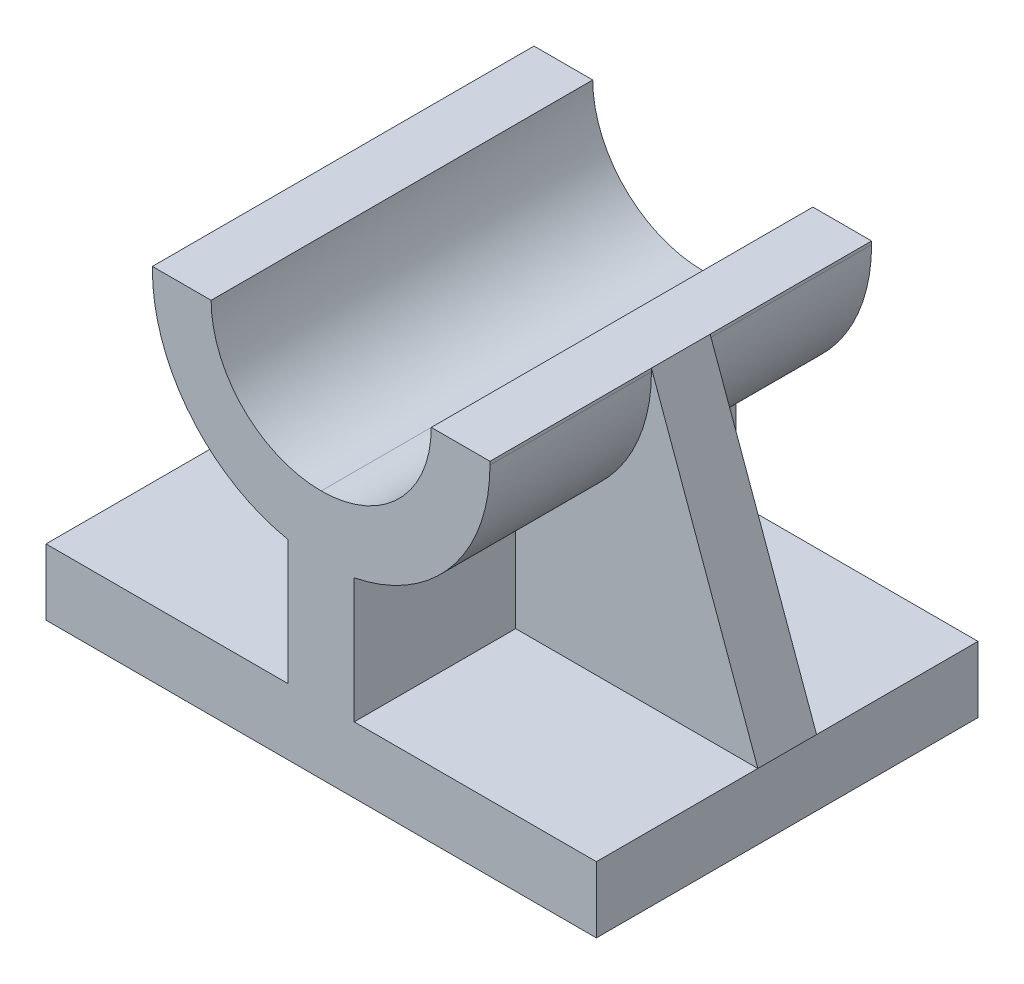
ISO-10303-21;
HEADER;
FILE_DESCRIPTION(('STEP AP214'),'2;1');
FILE_NAME('part.step','',(''),(''),'','','');
FILE_SCHEMA(('AUTOMOTIVE_DESIGN { 1 0 10303 214 1 1 1 1 }'));
ENDSEC;
DATA;
#1=APPLICATION_CONTEXT('core data for automotive mechanical design processes');
#2=APPLICATION_PROTOCOL_DEFINITION('international standard','automotive_design',2000,#1);
#3=PRODUCT_CONTEXT('',#1,'mechanical');
#4=PRODUCT('Part','Part','',(#3));
#5=PRODUCT_RELATED_PRODUCT_CATEGORY('part','',(#4));
#6=PRODUCT_DEFINITION_FORMATION('','',#4);
#7=PRODUCT_DEFINITION_CONTEXT('part definition',#1,'design');
#8=PRODUCT_DEFINITION('design','',#6,#7);
#9=PRODUCT_DEFINITION_SHAPE('','',#8);
#10=(LENGTH_UNIT() NAMED_UNIT(*) SI_UNIT(.MILLI.,.METRE.));
#11=(NAMED_UNIT(*) PLANE_ANGLE_UNIT() SI_UNIT($,.RADIAN.));
#12=(NAMED_UNIT(*) SI_UNIT($,.STERADIAN.) SOLID_ANGLE_UNIT());
#13=UNCERTAINTY_MEASURE_WITH_UNIT(LENGTH_MEASURE(1.E-05),#10,'distance_accuracy_value','');
#14=(GEOMETRIC_REPRESENTATION_CONTEXT(3) GLOBAL_UNCERTAINTY_ASSIGNED_CONTEXT((#13)) GLOBAL_UNIT_ASSIGNED_CONTEXT((#10,
#11,#12)) REPRESENTATION_CONTEXT('',''));
#15=CARTESIAN_POINT('',(0.,0.,0.));
#16=DIRECTION('',(0.,0.,1.));
#17=DIRECTION('',(1.,0.,0.));
#18=AXIS2_PLACEMENT_3D('',#15,#16,#17);
#19=CARTESIAN_POINT('',(0.,124.46,0.));
#20=DIRECTION('',(0.,-1.,0.));
#21=DIRECTION('',(0.,0.,-1.));
#22=AXIS2_PLACEMENT_3D('',#19,#20,#21);
#23=PLANE('',#22);
#24=DIRECTION('',(0.,0.,-1.));
#25=VECTOR('',#24,1.);
#26=CARTESIAN_POINT('',(153.67,124.46,132.08));
#27=LINE('',#26,#25);
#28=CARTESIAN_POINT('',(153.67,124.46,132.08));
#29=VERTEX_POINT('',#28);
#30=CARTESIAN_POINT('',(153.67,124.46,76.2));
#31=VERTEX_POINT('',#30);
#32=EDGE_CURVE('E249',#29,#31,#27,.T.);
#33=ORIENTED_EDGE('',*,*,#32,.T.);
#34=DIRECTION('',(0.,0.,-1.));
#35=VECTOR('',#34,1.);
#36=CARTESIAN_POINT('',(153.67,124.46,0.));
#37=LINE('',#36,#35);
#38=CARTESIAN_POINT('',(153.67,124.46,55.88));
#39=VERTEX_POINT('',#38);
#40=EDGE_CURVE('E310',#31,#39,#37,.T.);
#41=ORIENTED_EDGE('',*,*,#40,.T.);
#42=CARTESIAN_POINT('',(153.67,124.46,0.));
#43=VERTEX_POINT('',#42);
#44=EDGE_CURVE('E193',#39,#43,#27,.T.);
#45=ORIENTED_EDGE('',*,*,#44,.T.);
#46=DIRECTION('',(-1.,0.,0.));
#47=VECTOR('',#46,1.);
#48=CARTESIAN_POINT('',(36.83,124.46,0.));
#49=LINE('',#48,#47);
#50=CARTESIAN_POINT('',(133.35,124.46,0.));
#51=VERTEX_POINT('',#50);
#52=EDGE_CURVE('E185',#43,#51,#49,.T.);
#53=ORIENTED_EDGE('',*,*,#52,.T.);
#54=DIRECTION('',(0.,0.,-1.));
#55=VECTOR('',#54,1.);
#56=CARTESIAN_POINT('',(133.35,124.46,132.08));
#57=LINE('',#56,#55);
#58=CARTESIAN_POINT('',(133.35,124.46,132.08));
#59=VERTEX_POINT('',#58);
#60=EDGE_CURVE('E195',#59,#51,#57,.T.);
#61=ORIENTED_EDGE('',*,*,#60,.F.);
#62=DIRECTION('',(1.,0.,0.));
#63=VECTOR('',#62,1.);
#64=CARTESIAN_POINT('',(36.83,124.46,132.08));
#65=LINE('',#64,#63);
#66=EDGE_CURVE('E254',#59,#29,#65,.T.);
#67=ORIENTED_EDGE('',*,*,#66,.T.);
#68=EDGE_LOOP('',(#33,#41,#45,#53,#61,#67));
#69=FACE_BOUND('',#68,.T.);
#70=ADVANCED_FACE('F41',(#69),#23,.F.);
#71=DIRECTION('',(0.,0.,1.));
#72=VECTOR('',#71,1.);
#73=CARTESIAN_POINT('',(57.1500000000001,124.46,132.08));
#74=LINE('',#73,#72);
#75=CARTESIAN_POINT('',(57.15,124.46,0.));
#76=VERTEX_POINT('',#75);
#77=CARTESIAN_POINT('',(57.1500000000001,124.46,132.08));
#78=VERTEX_POINT('',#77);
#79=EDGE_CURVE('E197',#76,#78,#74,.T.);
#80=ORIENTED_EDGE('',*,*,#79,.F.);
#81=CARTESIAN_POINT('',(36.83,124.46,0.));
#82=VERTEX_POINT('',#81);
#83=EDGE_CURVE('E196',#76,#82,#49,.T.);
#84=ORIENTED_EDGE('',*,*,#83,.T.);
#85=DIRECTION('',(0.,0.,1.));
#86=VECTOR('',#85,1.);
#87=CARTESIAN_POINT('',(36.83,124.46,132.08));
#88=LINE('',#87,#86);
#89=CARTESIAN_POINT('',(36.83,124.46,132.08));
#90=VERTEX_POINT('',#89);
#91=EDGE_CURVE('E199',#82,#90,#88,.T.);
#92=ORIENTED_EDGE('',*,*,#91,.T.);
#93=EDGE_CURVE('E251',#90,#78,#65,.T.);
#94=ORIENTED_EDGE('',*,*,#93,.T.);
#95=EDGE_LOOP('',(#80,#84,#92,#94));
#96=FACE_BOUND('',#95,.T.);
#97=ADVANCED_FACE('F334',(#96),#23,.F.);
#98=CARTESIAN_POINT('',(36.83,124.46,132.08));
#99=DIRECTION('',(1.,0.,0.));
#100=DIRECTION('',(0.,0.,-1.));
#101=AXIS2_PLACEMENT_3D('',#98,#99,#100);
#102=PLANE('',#101);
#103=DIRECTION('',(0.,-1.,0.));
#104=VECTOR('',#103,1.);
#105=CARTESIAN_POINT('',(36.83,124.46,0.));
#106=LINE('',#105,#104);
#107=CARTESIAN_POINT('',(36.83,123.330937328691,0.));
#108=VERTEX_POINT('',#107);
#109=EDGE_CURVE('E265',#82,#108,#106,.T.);
#110=ORIENTED_EDGE('',*,*,#109,.T.);
#111=DIRECTION('',(0.,0.,-1.));
#112=VECTOR('',#111,1.);
#113=CARTESIAN_POINT('',(36.83,123.330937328691,132.08));
#114=LINE('',#113,#112);
#115=CARTESIAN_POINT('',(36.83,123.330937328691,132.08));
#116=VERTEX_POINT('',#115);
#117=EDGE_CURVE('E314',#108,#116,#114,.F.);
#118=ORIENTED_EDGE('',*,*,#117,.T.);
#119=DIRECTION('',(0.,-1.,0.));
#120=VECTOR('',#119,1.);
#121=CARTESIAN_POINT('',(36.83,124.46,132.08));
#122=LINE('',#121,#120);
#123=EDGE_CURVE('E258',#90,#116,#122,.T.);
#124=ORIENTED_EDGE('',*,*,#123,.F.);
#125=ORIENTED_EDGE('',*,*,#91,.F.);
#126=EDGE_LOOP('',(#110,#118,#124,#125));
#127=FACE_BOUND('',#126,.T.);
#128=ADVANCED_FACE('F351',(#127),#102,.F.);
#129=CARTESIAN_POINT('',(153.67,124.46,132.08));
#130=DIRECTION('',(-1.,0.,0.));
#131=DIRECTION('',(0.,0.,1.));
#132=AXIS2_PLACEMENT_3D('',#129,#130,#131);
#133=PLANE('',#132);
#134=DIRECTION('',(0.,-1.,0.));
#135=VECTOR('',#134,1.);
#136=CARTESIAN_POINT('',(153.67,124.46,132.08));
#137=LINE('',#136,#135);
#138=CARTESIAN_POINT('',(153.67,123.330937328691,132.08));
#139=VERTEX_POINT('',#138);
#140=EDGE_CURVE('E260',#29,#139,#137,.T.);
#141=ORIENTED_EDGE('',*,*,#140,.T.);
#142=DIRECTION('',(0.,0.,-1.));
#143=VECTOR('',#142,1.);
#144=CARTESIAN_POINT('',(153.67,123.330937328691,132.08));
#145=LINE('',#144,#143);
#146=CARTESIAN_POINT('',(153.67,123.330937328691,76.2));
#147=VERTEX_POINT('',#146);
#148=EDGE_CURVE('E324',#139,#147,#145,.T.);
#149=ORIENTED_EDGE('',*,*,#148,.T.);
#150=DIRECTION('',(0.,-1.,0.));
#151=VECTOR('',#150,1.);
#152=CARTESIAN_POINT('',(153.67,22.86,76.2));
#153=LINE('',#152,#151);
#154=EDGE_CURVE('E243',#31,#147,#153,.T.);
#155=ORIENTED_EDGE('',*,*,#154,.F.);
#156=ORIENTED_EDGE('',*,*,#32,.F.);
#157=EDGE_LOOP('',(#141,#149,#155,#156));
#158=FACE_BOUND('',#157,.T.);
#159=ADVANCED_FACE('F356',(#158),#133,.F.);
#160=DIRECTION('',(0.,1.,0.));
#161=VECTOR('',#160,1.);
#162=CARTESIAN_POINT('',(153.67,22.86,55.88));
#163=LINE('',#162,#161);
#164=CARTESIAN_POINT('',(153.67,123.330937328691,55.88));
#165=VERTEX_POINT('',#164);
#166=EDGE_CURVE('E241',#165,#39,#163,.T.);
#167=ORIENTED_EDGE('',*,*,#166,.F.);
#168=DIRECTION('',(0.,0.,1.));
#169=VECTOR('',#168,1.);
#170=CARTESIAN_POINT('',(153.67,123.330937328691,132.08));
#171=LINE('',#170,#169);
#172=CARTESIAN_POINT('',(153.67,123.330937328691,0.));
#173=VERTEX_POINT('',#172);
#174=EDGE_CURVE('E322',#165,#173,#171,.F.);
#175=ORIENTED_EDGE('',*,*,#174,.T.);
#176=DIRECTION('',(0.,-1.,0.));
#177=VECTOR('',#176,1.);
#178=CARTESIAN_POINT('',(153.67,124.46,0.));
#179=LINE('',#178,#177);
#180=EDGE_CURVE('E266',#43,#173,#179,.T.);
#181=ORIENTED_EDGE('',*,*,#180,.F.);
#182=ORIENTED_EDGE('',*,*,#44,.F.);
#183=EDGE_LOOP('',(#167,#175,#181,#182));
#184=FACE_BOUND('',#183,.T.);
#185=ADVANCED_FACE('F359',(#184),#133,.F.);
#186=CARTESIAN_POINT('',(0.,22.86,0.));
#187=DIRECTION('',(0.,1.,0.));
#188=DIRECTION('',(0.,0.,1.));
#189=AXIS2_PLACEMENT_3D('',#186,#187,#188);
#190=PLANE('',#189);
#191=DIRECTION('',(0.,0.,-1.));
#192=VECTOR('',#191,1.);
#193=CARTESIAN_POINT('',(190.5,22.86,0.));
#194=LINE('',#193,#192);
#195=CARTESIAN_POINT('',(190.5,22.86,132.08));
#196=VERTEX_POINT('',#195);
#197=CARTESIAN_POINT('',(190.5,22.86,76.2));
#198=VERTEX_POINT('',#197);
#199=EDGE_CURVE('E280',#196,#198,#194,.T.);
#200=ORIENTED_EDGE('',*,*,#199,.T.);
#201=DIRECTION('',(-1.,0.,0.));
#202=VECTOR('',#201,1.);
#203=CARTESIAN_POINT('',(190.5,22.86,76.2));
#204=LINE('',#203,#202);
#205=CARTESIAN_POINT('',(106.68,22.86,76.2));
#206=VERTEX_POINT('',#205);
#207=EDGE_CURVE('E247',#198,#206,#204,.T.);
#208=ORIENTED_EDGE('',*,*,#207,.T.);
#209=DIRECTION('',(0.,0.,-1.));
#210=VECTOR('',#209,1.);
#211=CARTESIAN_POINT('',(106.68,22.86,76.2));
#212=LINE('',#211,#210);
#213=CARTESIAN_POINT('',(106.68,22.86,132.08));
#214=VERTEX_POINT('',#213);
#215=EDGE_CURVE('E228',#214,#206,#212,.T.);
#216=ORIENTED_EDGE('',*,*,#215,.F.);
#217=DIRECTION('',(1.,0.,0.));
#218=VECTOR('',#217,1.);
#219=CARTESIAN_POINT('',(0.,22.86,132.08));
#220=LINE('',#219,#218);
#221=EDGE_CURVE('E275',#214,#196,#220,.T.);
#222=ORIENTED_EDGE('',*,*,#221,.T.);
#223=EDGE_LOOP('',(#200,#208,#216,#222));
#224=FACE_BOUND('',#223,.T.);
#225=ADVANCED_FACE('F361',(#224),#190,.T.);
#226=DIRECTION('',(-1.,0.,0.));
#227=VECTOR('',#226,1.);
#228=CARTESIAN_POINT('',(190.5,22.86,55.88));
#229=LINE('',#228,#227);
#230=CARTESIAN_POINT('',(190.5,22.86,55.88));
#231=VERTEX_POINT('',#230);
#232=CARTESIAN_POINT('',(106.68,22.86,55.88));
#233=VERTEX_POINT('',#232);
#234=EDGE_CURVE('E246',#231,#233,#229,.T.);
#235=ORIENTED_EDGE('',*,*,#234,.F.);
#236=CARTESIAN_POINT('',(190.5,22.86,0.));
#237=VERTEX_POINT('',#236);
#238=EDGE_CURVE('E277',#231,#237,#194,.T.);
#239=ORIENTED_EDGE('',*,*,#238,.T.);
#240=DIRECTION('',(-1.,0.,0.));
#241=VECTOR('',#240,1.);
#242=CARTESIAN_POINT('',(0.,22.86,0.));
#243=LINE('',#242,#241);
#244=CARTESIAN_POINT('',(106.68,22.86,0.));
#245=VERTEX_POINT('',#244);
#246=EDGE_CURVE('E284',#237,#245,#243,.T.);
#247=ORIENTED_EDGE('',*,*,#246,.T.);
#248=DIRECTION('',(0.,0.,-1.));
#249=VECTOR('',#248,1.);
#250=CARTESIAN_POINT('',(106.68,22.86,55.88));
#251=LINE('',#250,#249);
#252=EDGE_CURVE('E235',#233,#245,#251,.T.);
#253=ORIENTED_EDGE('',*,*,#252,.F.);
#254=EDGE_LOOP('',(#235,#239,#247,#253));
#255=FACE_BOUND('',#254,.T.);
#256=ADVANCED_FACE('F369',(#255),#190,.T.);
#257=CARTESIAN_POINT('',(0.,22.86,0.));
#258=DIRECTION('',(1.,0.,0.));
#259=DIRECTION('',(0.,0.,-1.));
#260=AXIS2_PLACEMENT_3D('',#257,#258,#259);
#261=PLANE('',#260);
#262=DIRECTION('',(0.,0.,1.));
#263=VECTOR('',#262,1.);
#264=CARTESIAN_POINT('',(0.,0.,0.));
#265=LINE('',#264,#263);
#266=CARTESIAN_POINT('',(0.,0.,0.));
#267=VERTEX_POINT('',#266);
#268=CARTESIAN_POINT('',(0.,0.,132.08));
#269=VERTEX_POINT('',#268);
#270=EDGE_CURVE('E269',#267,#269,#265,.T.);
#271=ORIENTED_EDGE('',*,*,#270,.T.);
#272=DIRECTION('',(0.,-1.,0.));
#273=VECTOR('',#272,1.);
#274=CARTESIAN_POINT('',(0.,22.86,132.08));
#275=LINE('',#274,#273);
#276=CARTESIAN_POINT('',(0.,22.86,132.08));
#277=VERTEX_POINT('',#276);
#278=EDGE_CURVE('E299',#277,#269,#275,.T.);
#279=ORIENTED_EDGE('',*,*,#278,.F.);
#280=DIRECTION('',(0.,0.,1.));
#281=VECTOR('',#280,1.);
#282=CARTESIAN_POINT('',(0.,22.86,0.));
#283=LINE('',#282,#281);
#284=CARTESIAN_POINT('',(0.,22.86,0.));
#285=VERTEX_POINT('',#284);
#286=EDGE_CURVE('E268',#285,#277,#283,.T.);
#287=ORIENTED_EDGE('',*,*,#286,.F.);
#288=DIRECTION('',(0.,-1.,0.));
#289=VECTOR('',#288,1.);
#290=CARTESIAN_POINT('',(0.,22.86,0.));
#291=LINE('',#290,#289);
#292=EDGE_CURVE('E285',#285,#267,#291,.T.);
#293=ORIENTED_EDGE('',*,*,#292,.T.);
#294=EDGE_LOOP('',(#271,#279,#287,#293));
#295=FACE_BOUND('',#294,.T.);
#296=ADVANCED_FACE('F382',(#295),#261,.F.);
#297=CARTESIAN_POINT('',(0.,22.86,132.08));
#298=DIRECTION('',(0.,0.,-1.));
#299=DIRECTION('',(-1.,0.,0.));
#300=AXIS2_PLACEMENT_3D('',#297,#298,#299);
#301=PLANE('',#300);
#302=ORIENTED_EDGE('',*,*,#123,.T.);
#303=CARTESIAN_POINT('',(95.25,123.330937328691,132.08));
#304=DIRECTION('',(0.,0.,-1.));
#305=DIRECTION('',(-1.,0.,0.));
#306=AXIS2_PLACEMENT_3D('',#303,#304,#305);
#307=CIRCLE('',#306,58.42);
#308=CARTESIAN_POINT('',(83.82,66.04,132.08));
#309=VERTEX_POINT('',#308);
#310=EDGE_CURVE('E316',#116,#309,#307,.F.);
#311=ORIENTED_EDGE('',*,*,#310,.T.);
#312=DIRECTION('',(0.,1.,0.));
#313=VECTOR('',#312,1.);
#314=CARTESIAN_POINT('',(83.82,22.86,132.08));
#315=LINE('',#314,#313);
#316=CARTESIAN_POINT('',(83.82,22.86,132.08));
#317=VERTEX_POINT('',#316);
#318=EDGE_CURVE('E212',#317,#309,#315,.T.);
#319=ORIENTED_EDGE('',*,*,#318,.F.);
#320=EDGE_CURVE('E274',#277,#317,#220,.T.);
#321=ORIENTED_EDGE('',*,*,#320,.F.);
#322=ORIENTED_EDGE('',*,*,#278,.T.);
#323=DIRECTION('',(1.,0.,0.));
#324=VECTOR('',#323,1.);
#325=CARTESIAN_POINT('',(0.,0.,132.08));
#326=LINE('',#325,#324);
#327=CARTESIAN_POINT('',(190.5,0.,132.08));
#328=VERTEX_POINT('',#327);
#329=EDGE_CURVE('E286',#269,#328,#326,.T.);
#330=ORIENTED_EDGE('',*,*,#329,.T.);
#331=DIRECTION('',(0.,-1.,0.));
#332=VECTOR('',#331,1.);
#333=CARTESIAN_POINT('',(190.5,22.86,132.08));
#334=LINE('',#333,#332);
#335=EDGE_CURVE('E298',#196,#328,#334,.T.);
#336=ORIENTED_EDGE('',*,*,#335,.F.);
#337=ORIENTED_EDGE('',*,*,#221,.F.);
#338=DIRECTION('',(0.,-1.,0.));
#339=VECTOR('',#338,1.);
#340=CARTESIAN_POINT('',(106.68,22.86,132.08));
#341=LINE('',#340,#339);
#342=CARTESIAN_POINT('',(106.68,66.04,132.08));
#343=VERTEX_POINT('',#342);
#344=EDGE_CURVE('E224',#343,#214,#341,.T.);
#345=ORIENTED_EDGE('',*,*,#344,.F.);
#346=CARTESIAN_POINT('',(95.25,123.330937328691,132.08));
#347=DIRECTION('',(0.,0.,-1.));
#348=DIRECTION('',(-1.,0.,0.));
#349=AXIS2_PLACEMENT_3D('',#346,#347,#348);
#350=CIRCLE('',#349,58.42);
#351=EDGE_CURVE('E320',#343,#139,#350,.F.);
#352=ORIENTED_EDGE('',*,*,#351,.T.);
#353=ORIENTED_EDGE('',*,*,#140,.F.);
#354=ORIENTED_EDGE('',*,*,#66,.F.);
#355=CARTESIAN_POINT('',(95.2500000000001,124.46,132.08));
#356=DIRECTION('',(0.,0.,-1.));
#357=DIRECTION('',(-1.,0.,0.));
#358=AXIS2_PLACEMENT_3D('',#355,#356,#357);
#359=CIRCLE('',#358,38.1);
#360=CARTESIAN_POINT('',(95.2500000000001,86.36,132.08));
#361=VERTEX_POINT('',#360);
#362=EDGE_CURVE('E60',#59,#361,#359,.T.);
#363=ORIENTED_EDGE('',*,*,#362,.T.);
#364=CARTESIAN_POINT('',(95.2500000000001,124.46,132.08));
#365=DIRECTION('',(0.,0.,-1.));
#366=DIRECTION('',(-1.,0.,0.));
#367=AXIS2_PLACEMENT_3D('',#364,#365,#366);
#368=CIRCLE('',#367,38.1);
#369=EDGE_CURVE('E49',#361,#78,#368,.T.);
#370=ORIENTED_EDGE('',*,*,#369,.T.);
#371=ORIENTED_EDGE('',*,*,#93,.F.);
#372=EDGE_LOOP('',(#302,#311,#319,#321,#322,#330,#336,#337,#345,#352,#353,#354,#363,#370,#371));
#373=FACE_BOUND('',#372,.T.);
#374=ADVANCED_FACE('F327',(#373),#301,.F.);
#375=CARTESIAN_POINT('',(190.5,22.86,0.));
#376=DIRECTION('',(-1.,0.,0.));
#377=DIRECTION('',(0.,0.,1.));
#378=AXIS2_PLACEMENT_3D('',#375,#376,#377);
#379=PLANE('',#378);
#380=ORIENTED_EDGE('',*,*,#238,.F.);
#381=DIRECTION('',(0.,0.,1.));
#382=VECTOR('',#381,1.);
#383=CARTESIAN_POINT('',(190.5,22.8599999999989,0.));
#384=LINE('',#383,#382);
#385=EDGE_CURVE('E305',#231,#198,#384,.T.);
#386=ORIENTED_EDGE('',*,*,#385,.T.);
#387=ORIENTED_EDGE('',*,*,#199,.F.);
#388=ORIENTED_EDGE('',*,*,#335,.T.);
#389=DIRECTION('',(0.,0.,-1.));
#390=VECTOR('',#389,1.);
#391=CARTESIAN_POINT('',(190.5,0.,0.));
#392=LINE('',#391,#390);
#393=CARTESIAN_POINT('',(190.5,0.,0.));
#394=VERTEX_POINT('',#393);
#395=EDGE_CURVE('E289',#328,#394,#392,.T.);
#396=ORIENTED_EDGE('',*,*,#395,.T.);
#397=DIRECTION('',(0.,-1.,0.));
#398=VECTOR('',#397,1.);
#399=CARTESIAN_POINT('',(190.5,22.86,0.));
#400=LINE('',#399,#398);
#401=EDGE_CURVE('E291',#237,#394,#400,.T.);
#402=ORIENTED_EDGE('',*,*,#401,.F.);
#403=EDGE_LOOP('',(#380,#386,#387,#388,#396,#402));
#404=FACE_BOUND('',#403,.T.);
#405=ADVANCED_FACE('F374',(#404),#379,.F.);
#406=CARTESIAN_POINT('',(0.,22.86,0.));
#407=DIRECTION('',(0.,0.,1.));
#408=DIRECTION('',(1.,0.,0.));
#409=AXIS2_PLACEMENT_3D('',#406,#407,#408);
#410=PLANE('',#409);
#411=DIRECTION('',(0.,-1.,0.));
#412=VECTOR('',#411,1.);
#413=CARTESIAN_POINT('',(83.82,22.86,0.));
#414=LINE('',#413,#412);
#415=CARTESIAN_POINT('',(83.82,66.04,0.));
#416=VERTEX_POINT('',#415);
#417=CARTESIAN_POINT('',(83.82,22.86,0.));
#418=VERTEX_POINT('',#417);
#419=EDGE_CURVE('E204',#416,#418,#414,.T.);
#420=ORIENTED_EDGE('',*,*,#419,.F.);
#421=CARTESIAN_POINT('',(95.25,123.330937328691,0.));
#422=DIRECTION('',(0.,0.,1.));
#423=DIRECTION('',(1.,0.,0.));
#424=AXIS2_PLACEMENT_3D('',#421,#422,#423);
#425=CIRCLE('',#424,58.42);
#426=EDGE_CURVE('E312',#416,#108,#425,.F.);
#427=ORIENTED_EDGE('',*,*,#426,.T.);
#428=ORIENTED_EDGE('',*,*,#109,.F.);
#429=ORIENTED_EDGE('',*,*,#83,.F.);
#430=CARTESIAN_POINT('',(95.25,124.46,0.));
#431=DIRECTION('',(0.,0.,1.));
#432=DIRECTION('',(1.,0.,0.));
#433=AXIS2_PLACEMENT_3D('',#430,#431,#432);
#434=CIRCLE('',#433,38.1);
#435=CARTESIAN_POINT('',(95.25,86.36,0.));
#436=VERTEX_POINT('',#435);
#437=EDGE_CURVE('E11',#76,#436,#434,.T.);
#438=ORIENTED_EDGE('',*,*,#437,.T.);
#439=CARTESIAN_POINT('',(95.25,124.46,0.));
#440=DIRECTION('',(0.,0.,1.));
#441=DIRECTION('',(1.,0.,0.));
#442=AXIS2_PLACEMENT_3D('',#439,#440,#441);
#443=CIRCLE('',#442,38.1);
#444=EDGE_CURVE('E180',#436,#51,#443,.T.);
#445=ORIENTED_EDGE('',*,*,#444,.T.);
#446=ORIENTED_EDGE('',*,*,#52,.F.);
#447=ORIENTED_EDGE('',*,*,#180,.T.);
#448=CARTESIAN_POINT('',(95.25,123.330937328691,0.));
#449=DIRECTION('',(0.,0.,1.));
#450=DIRECTION('',(1.,0.,0.));
#451=AXIS2_PLACEMENT_3D('',#448,#449,#450);
#452=CIRCLE('',#451,58.42);
#453=CARTESIAN_POINT('',(106.68,66.04,0.));
#454=VERTEX_POINT('',#453);
#455=EDGE_CURVE('E311',#173,#454,#452,.F.);
#456=ORIENTED_EDGE('',*,*,#455,.T.);
#457=DIRECTION('',(0.,1.,0.));
#458=VECTOR('',#457,1.);
#459=CARTESIAN_POINT('',(106.68,22.86,0.));
#460=LINE('',#459,#458);
#461=EDGE_CURVE('E232',#245,#454,#460,.T.);
#462=ORIENTED_EDGE('',*,*,#461,.F.);
#463=ORIENTED_EDGE('',*,*,#246,.F.);
#464=ORIENTED_EDGE('',*,*,#401,.T.);
#465=DIRECTION('',(-1.,0.,0.));
#466=VECTOR('',#465,1.);
#467=CARTESIAN_POINT('',(0.,0.,0.));
#468=LINE('',#467,#466);
#469=EDGE_CURVE('E271',#394,#267,#468,.T.);
#470=ORIENTED_EDGE('',*,*,#469,.T.);
#471=ORIENTED_EDGE('',*,*,#292,.F.);
#472=EDGE_CURVE('E278',#418,#285,#243,.T.);
#473=ORIENTED_EDGE('',*,*,#472,.F.);
#474=EDGE_LOOP('',(#420,#427,#428,#429,#438,#445,#446,#447,#456,#462,#463,#464,#470,#471,#473));
#475=FACE_BOUND('',#474,.T.);
#476=ADVANCED_FACE('F179',(#475),#410,.F.);
#477=ORIENTED_EDGE('',*,*,#320,.T.);
#478=DIRECTION('',(0.,0.,1.));
#479=VECTOR('',#478,1.);
#480=CARTESIAN_POINT('',(83.82,22.86,0.));
#481=LINE('',#480,#479);
#482=EDGE_CURVE('E206',#418,#317,#481,.T.);
#483=ORIENTED_EDGE('',*,*,#482,.F.);
#484=ORIENTED_EDGE('',*,*,#472,.T.);
#485=ORIENTED_EDGE('',*,*,#286,.T.);
#486=EDGE_LOOP('',(#477,#483,#484,#485));
#487=FACE_BOUND('',#486,.T.);
#488=ADVANCED_FACE('F362',(#487),#190,.T.);
#489=CARTESIAN_POINT('',(0.,0.,0.));
#490=DIRECTION('',(0.,1.,0.));
#491=DIRECTION('',(0.,0.,1.));
#492=AXIS2_PLACEMENT_3D('',#489,#490,#491);
#493=PLANE('',#492);
#494=ORIENTED_EDGE('',*,*,#270,.F.);
#495=ORIENTED_EDGE('',*,*,#469,.F.);
#496=ORIENTED_EDGE('',*,*,#395,.F.);
#497=ORIENTED_EDGE('',*,*,#329,.F.);
#498=EDGE_LOOP('',(#494,#495,#496,#497));
#499=FACE_BOUND('',#498,.T.);
#500=ADVANCED_FACE('F368',(#499),#493,.F.);
#501=CARTESIAN_POINT('',(190.5,22.86,55.88));
#502=DIRECTION('',(0.,0.,1.));
#503=DIRECTION('',(1.,0.,0.));
#504=AXIS2_PLACEMENT_3D('',#501,#502,#503);
#505=PLANE('',#504);
#506=DIRECTION('',(0.,-1.,0.));
#507=VECTOR('',#506,1.);
#508=CARTESIAN_POINT('',(106.68,22.86,55.88));
#509=LINE('',#508,#507);
#510=CARTESIAN_POINT('',(106.68,66.04,55.88));
#511=VERTEX_POINT('',#510);
#512=EDGE_CURVE('E230',#511,#233,#509,.T.);
#513=ORIENTED_EDGE('',*,*,#512,.F.);
#514=CARTESIAN_POINT('',(95.25,123.330937328691,55.88));
#515=DIRECTION('',(0.,0.,1.));
#516=DIRECTION('',(1.,0.,0.));
#517=AXIS2_PLACEMENT_3D('',#514,#515,#516);
#518=CIRCLE('',#517,58.42);
#519=EDGE_CURVE('E323',#511,#165,#518,.T.);
#520=ORIENTED_EDGE('',*,*,#519,.T.);
#521=ORIENTED_EDGE('',*,*,#166,.T.);
#522=DIRECTION('',(-0.340799323621398,0.940136065162484,0.));
#523=VECTOR('',#522,1.);
#524=CARTESIAN_POINT('',(190.5,22.8599999999989,55.88));
#525=LINE('',#524,#523);
#526=EDGE_CURVE('E307',#39,#231,#525,.F.);
#527=ORIENTED_EDGE('',*,*,#526,.T.);
#528=ORIENTED_EDGE('',*,*,#234,.T.);
#529=EDGE_LOOP('',(#513,#520,#521,#527,#528));
#530=FACE_BOUND('',#529,.T.);
#531=ADVANCED_FACE('F353',(#530),#505,.F.);
#532=CARTESIAN_POINT('',(190.5,22.86,76.2));
#533=DIRECTION('',(0.,0.,-1.));
#534=DIRECTION('',(-1.,0.,0.));
#535=AXIS2_PLACEMENT_3D('',#532,#533,#534);
#536=PLANE('',#535);
#537=ORIENTED_EDGE('',*,*,#207,.F.);
#538=DIRECTION('',(0.340799323621398,-0.940136065162484,0.));
#539=VECTOR('',#538,1.);
#540=CARTESIAN_POINT('',(190.5,22.8599999999989,76.2));
#541=LINE('',#540,#539);
#542=EDGE_CURVE('E304',#198,#31,#541,.F.);
#543=ORIENTED_EDGE('',*,*,#542,.T.);
#544=ORIENTED_EDGE('',*,*,#154,.T.);
#545=CARTESIAN_POINT('',(95.25,123.330937328691,76.2));
#546=DIRECTION('',(0.,0.,-1.));
#547=DIRECTION('',(-1.,0.,0.));
#548=AXIS2_PLACEMENT_3D('',#545,#546,#547);
#549=CIRCLE('',#548,58.42);
#550=CARTESIAN_POINT('',(106.68,66.04,76.2));
#551=VERTEX_POINT('',#550);
#552=EDGE_CURVE('E190',#147,#551,#549,.T.);
#553=ORIENTED_EDGE('',*,*,#552,.T.);
#554=DIRECTION('',(0.,1.,0.));
#555=VECTOR('',#554,1.);
#556=CARTESIAN_POINT('',(106.68,22.86,76.2));
#557=LINE('',#556,#555);
#558=EDGE_CURVE('E216',#206,#551,#557,.T.);
#559=ORIENTED_EDGE('',*,*,#558,.F.);
#560=EDGE_LOOP('',(#537,#543,#544,#553,#559));
#561=FACE_BOUND('',#560,.T.);
#562=ADVANCED_FACE('F434',(#561),#536,.F.);
#563=CARTESIAN_POINT('',(106.68,0.,0.));
#564=DIRECTION('',(-1.,0.,0.));
#565=DIRECTION('',(0.,0.,1.));
#566=AXIS2_PLACEMENT_3D('',#563,#564,#565);
#567=PLANE('',#566);
#568=ORIENTED_EDGE('',*,*,#512,.T.);
#569=ORIENTED_EDGE('',*,*,#252,.T.);
#570=ORIENTED_EDGE('',*,*,#461,.T.);
#571=DIRECTION('',(0.,0.,1.));
#572=VECTOR('',#571,1.);
#573=CARTESIAN_POINT('',(106.68,66.04,55.88));
#574=LINE('',#573,#572);
#575=EDGE_CURVE('E238',#454,#511,#574,.T.);
#576=ORIENTED_EDGE('',*,*,#575,.T.);
#577=EDGE_LOOP('',(#568,#569,#570,#576));
#578=FACE_BOUND('',#577,.T.);
#579=ADVANCED_FACE('F410',(#578),#567,.F.);
#580=CARTESIAN_POINT('',(106.68,0.,0.));
#581=DIRECTION('',(1.,0.,0.));
#582=DIRECTION('',(0.,0.,-1.));
#583=AXIS2_PLACEMENT_3D('',#580,#581,#582);
#584=PLANE('',#583);
#585=ORIENTED_EDGE('',*,*,#558,.T.);
#586=DIRECTION('',(0.,0.,1.));
#587=VECTOR('',#586,1.);
#588=CARTESIAN_POINT('',(106.68,66.04,76.2));
#589=LINE('',#588,#587);
#590=EDGE_CURVE('E217',#551,#343,#589,.T.);
#591=ORIENTED_EDGE('',*,*,#590,.T.);
#592=ORIENTED_EDGE('',*,*,#344,.T.);
#593=ORIENTED_EDGE('',*,*,#215,.T.);
#594=EDGE_LOOP('',(#585,#591,#592,#593));
#595=FACE_BOUND('',#594,.T.);
#596=ADVANCED_FACE('F439',(#595),#584,.T.);
#597=CARTESIAN_POINT('',(83.82,0.,0.));
#598=DIRECTION('',(1.,0.,0.));
#599=DIRECTION('',(0.,0.,-1.));
#600=AXIS2_PLACEMENT_3D('',#597,#598,#599);
#601=PLANE('',#600);
#602=ORIENTED_EDGE('',*,*,#419,.T.);
#603=ORIENTED_EDGE('',*,*,#482,.T.);
#604=ORIENTED_EDGE('',*,*,#318,.T.);
#605=DIRECTION('',(0.,0.,-1.));
#606=VECTOR('',#605,1.);
#607=CARTESIAN_POINT('',(83.82,66.04,0.));
#608=LINE('',#607,#606);
#609=EDGE_CURVE('E211',#309,#416,#608,.T.);
#610=ORIENTED_EDGE('',*,*,#609,.T.);
#611=EDGE_LOOP('',(#602,#603,#604,#610));
#612=FACE_BOUND('',#611,.T.);
#613=ADVANCED_FACE('F391',(#612),#601,.F.);
#614=CARTESIAN_POINT('',(190.5,22.8599999999989,0.));
#615=DIRECTION('',(-0.940136065162484,-0.340799323621398,0.));
#616=DIRECTION('',(0.,0.,1.));
#617=AXIS2_PLACEMENT_3D('',#614,#615,#616);
#618=PLANE('',#617);
#619=ORIENTED_EDGE('',*,*,#526,.F.);
#620=ORIENTED_EDGE('',*,*,#40,.F.);
#621=ORIENTED_EDGE('',*,*,#542,.F.);
#622=ORIENTED_EDGE('',*,*,#385,.F.);
#623=EDGE_LOOP('',(#619,#620,#621,#622));
#624=FACE_BOUND('',#623,.T.);
#625=ADVANCED_FACE('F387',(#624),#618,.F.);
#626=CARTESIAN_POINT('',(95.25,123.330937328691,0.));
#627=DIRECTION('',(0.,0.,-1.));
#628=DIRECTION('',(-1.,0.,0.));
#629=AXIS2_PLACEMENT_3D('',#626,#627,#628);
#630=CYLINDRICAL_SURFACE('',#629,58.42);
#631=ORIENTED_EDGE('',*,*,#310,.F.);
#632=ORIENTED_EDGE('',*,*,#117,.F.);
#633=ORIENTED_EDGE('',*,*,#426,.F.);
#634=ORIENTED_EDGE('',*,*,#609,.F.);
#635=EDGE_LOOP('',(#631,#632,#633,#634));
#636=FACE_BOUND('',#635,.T.);
#637=ADVANCED_FACE('F394',(#636),#630,.T.);
#638=CARTESIAN_POINT('',(95.25,123.330937328691,55.88));
#639=DIRECTION('',(0.,0.,1.));
#640=DIRECTION('',(1.,0.,0.));
#641=AXIS2_PLACEMENT_3D('',#638,#639,#640);
#642=CYLINDRICAL_SURFACE('',#641,58.42);
#643=ORIENTED_EDGE('',*,*,#455,.F.);
#644=ORIENTED_EDGE('',*,*,#174,.F.);
#645=ORIENTED_EDGE('',*,*,#519,.F.);
#646=ORIENTED_EDGE('',*,*,#575,.F.);
#647=EDGE_LOOP('',(#643,#644,#645,#646));
#648=FACE_BOUND('',#647,.T.);
#649=ADVANCED_FACE('F344',(#648),#642,.T.);
#650=CARTESIAN_POINT('',(95.25,123.330937328691,76.2));
#651=DIRECTION('',(0.,0.,-1.));
#652=DIRECTION('',(-1.,0.,0.));
#653=AXIS2_PLACEMENT_3D('',#650,#651,#652);
#654=CYLINDRICAL_SURFACE('',#653,58.42);
#655=ORIENTED_EDGE('',*,*,#552,.F.);
#656=ORIENTED_EDGE('',*,*,#148,.F.);
#657=ORIENTED_EDGE('',*,*,#351,.F.);
#658=ORIENTED_EDGE('',*,*,#590,.F.);
#659=EDGE_LOOP('',(#655,#656,#657,#658));
#660=FACE_BOUND('',#659,.T.);
#661=ADVANCED_FACE('F340',(#660),#654,.T.);
#662=CARTESIAN_POINT('',(95.25,124.46,0.));
#663=DIRECTION('',(0.,0.,-1.));
#664=DIRECTION('',(-1.,0.,0.));
#665=AXIS2_PLACEMENT_3D('',#662,#663,#664);
#666=CYLINDRICAL_SURFACE('',#665,38.1);
#667=ORIENTED_EDGE('',*,*,#79,.T.);
#668=ORIENTED_EDGE('',*,*,#369,.F.);
#669=DIRECTION('',(0.,0.,1.));
#670=VECTOR('',#669,1.);
#671=CARTESIAN_POINT('',(95.2500000000001,86.36,132.08));
#672=LINE('',#671,#670);
#673=EDGE_CURVE('E44',#436,#361,#672,.T.);
#674=ORIENTED_EDGE('',*,*,#673,.F.);
#675=ORIENTED_EDGE('',*,*,#437,.F.);
#676=EDGE_LOOP('',(#667,#668,#674,#675));
#677=FACE_BOUND('',#676,.T.);
#678=ADVANCED_FACE('F43',(#677),#666,.F.);
#679=CARTESIAN_POINT('',(95.25,124.46,0.));
#680=DIRECTION('',(0.,0.,1.));
#681=DIRECTION('',(1.,0.,0.));
#682=AXIS2_PLACEMENT_3D('',#679,#680,#681);
#683=CYLINDRICAL_SURFACE('',#682,38.1);
#684=ORIENTED_EDGE('',*,*,#362,.F.);
#685=ORIENTED_EDGE('',*,*,#60,.T.);
#686=ORIENTED_EDGE('',*,*,#444,.F.);
#687=ORIENTED_EDGE('',*,*,#673,.T.);
#688=EDGE_LOOP('',(#684,#685,#686,#687));
#689=FACE_BOUND('',#688,.T.);
#690=ADVANCED_FACE('F198',(#689),#683,.F.);
#691=CLOSED_SHELL('',(#70,#97,#128,#159,#185,#225,#256,#296,#374,#405,#476,#488,#500,#531,#562,
#579,#596,#613,#625,#637,#649,#661,#678,#690));
#692=MANIFOLD_SOLID_BREP('B2',#691);
#693=ADVANCED_BREP_SHAPE_REPRESENTATION('',(#18,#692),#14);
#694=SHAPE_DEFINITION_REPRESENTATION(#9,#693);
ENDSEC;
END-ISO-10303-21;
